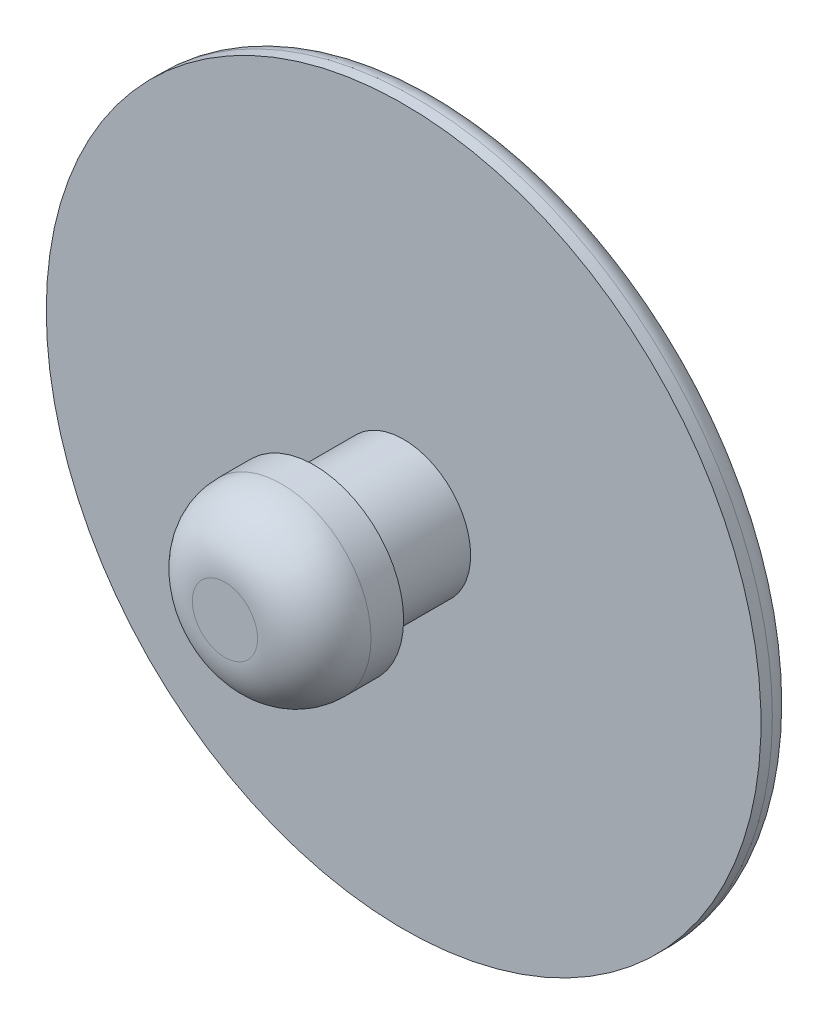
ISO-10303-21;
HEADER;
FILE_DESCRIPTION(('STEP AP214'),'2;1');
FILE_NAME('part.step','',(''),(''),'','','');
FILE_SCHEMA(('AUTOMOTIVE_DESIGN { 1 0 10303 214 1 1 1 1 }'));
ENDSEC;
DATA;
#1=APPLICATION_CONTEXT('core data for automotive mechanical design processes');
#2=APPLICATION_PROTOCOL_DEFINITION('international standard','automotive_design',2000,#1);
#3=PRODUCT_CONTEXT('',#1,'mechanical');
#4=PRODUCT('Part','Part','',(#3));
#5=PRODUCT_RELATED_PRODUCT_CATEGORY('part','',(#4));
#6=PRODUCT_DEFINITION_FORMATION('','',#4);
#7=PRODUCT_DEFINITION_CONTEXT('part definition',#1,'design');
#8=PRODUCT_DEFINITION('design','',#6,#7);
#9=PRODUCT_DEFINITION_SHAPE('','',#8);
#10=(LENGTH_UNIT() NAMED_UNIT(*) SI_UNIT(.MILLI.,.METRE.));
#11=(NAMED_UNIT(*) PLANE_ANGLE_UNIT() SI_UNIT($,.RADIAN.));
#12=(NAMED_UNIT(*) SI_UNIT($,.STERADIAN.) SOLID_ANGLE_UNIT());
#13=UNCERTAINTY_MEASURE_WITH_UNIT(LENGTH_MEASURE(1.E-05),#10,'distance_accuracy_value','');
#14=(GEOMETRIC_REPRESENTATION_CONTEXT(3) GLOBAL_UNCERTAINTY_ASSIGNED_CONTEXT((#13)) GLOBAL_UNIT_ASSIGNED_CONTEXT((#10,
#11,#12)) REPRESENTATION_CONTEXT('',''));
#15=CARTESIAN_POINT('',(0.,0.,0.));
#16=DIRECTION('',(0.,0.,1.));
#17=DIRECTION('',(1.,0.,0.));
#18=AXIS2_PLACEMENT_3D('',#15,#16,#17);
#19=CARTESIAN_POINT('',(0.,0.,0.762));
#20=DIRECTION('',(0.,0.,1.));
#21=DIRECTION('',(1.,0.,0.));
#22=AXIS2_PLACEMENT_3D('',#19,#20,#21);
#23=PLANE('',#22);
#24=CARTESIAN_POINT('',(0.,0.,0.762));
#25=DIRECTION('',(0.,0.,1.));
#26=DIRECTION('',(1.,0.,0.));
#27=AXIS2_PLACEMENT_3D('',#24,#25,#26);
#28=CIRCLE('',#27,8.);
#29=CARTESIAN_POINT('',(-8.,0.,0.762));
#30=VERTEX_POINT('',#29);
#31=EDGE_CURVE('E51',#30,#30,#28,.T.);
#32=ORIENTED_EDGE('',*,*,#31,.T.);
#33=EDGE_LOOP('',(#32));
#34=FACE_BOUND('',#33,.T.);
#35=CARTESIAN_POINT('',(0.,0.,0.762));
#36=DIRECTION('',(0.,0.,1.));
#37=DIRECTION('',(1.,0.,0.));
#38=AXIS2_PLACEMENT_3D('',#35,#36,#37);
#39=CIRCLE('',#38,1.5);
#40=CARTESIAN_POINT('',(1.5,0.,0.762));
#41=VERTEX_POINT('',#40);
#42=EDGE_CURVE('E55',#41,#41,#39,.T.);
#43=ORIENTED_EDGE('',*,*,#42,.F.);
#44=EDGE_LOOP('',(#43));
#45=FACE_BOUND('',#44,.T.);
#46=ADVANCED_FACE('F31',(#34,#45),#23,.T.);
#47=CARTESIAN_POINT('',(0.,0.,0.762));
#48=DIRECTION('',(0.,0.,-1.));
#49=DIRECTION('',(-1.,0.,0.));
#50=AXIS2_PLACEMENT_3D('',#47,#48,#49);
#51=CYLINDRICAL_SURFACE('',#50,8.);
#52=CARTESIAN_POINT('',(0.,0.,0.508));
#53=DIRECTION('',(0.,0.,1.));
#54=DIRECTION('',(1.,0.,0.));
#55=AXIS2_PLACEMENT_3D('',#52,#53,#54);
#56=CIRCLE('',#55,8.);
#57=CARTESIAN_POINT('',(-8.,0.,0.508));
#58=VERTEX_POINT('',#57);
#59=EDGE_CURVE('E46',#58,#58,#56,.T.);
#60=CARTESIAN_POINT('',(-8.,0.,0.508));
#61=CARTESIAN_POINT('',(-8.,0.,0.510645833333333));
#62=CARTESIAN_POINT('',(-8.,0.,0.513291666666667));
#63=CARTESIAN_POINT('',(-8.,0.,0.518583333333333));
#64=CARTESIAN_POINT('',(-8.,0.,0.521229166666667));
#65=CARTESIAN_POINT('',(-8.,0.,0.526520833333333));
#66=CARTESIAN_POINT('',(-8.,0.,0.529166666666667));
#67=CARTESIAN_POINT('',(-8.,0.,0.534458333333333));
#68=CARTESIAN_POINT('',(-8.,0.,0.537104166666666));
#69=CARTESIAN_POINT('',(-8.,0.,0.542395833333333));
#70=CARTESIAN_POINT('',(-8.,0.,0.545041666666667));
#71=CARTESIAN_POINT('',(-8.,0.,0.550333333333333));
#72=CARTESIAN_POINT('',(-8.,0.,0.552979166666667));
#73=CARTESIAN_POINT('',(-8.,0.,0.558270833333333));
#74=CARTESIAN_POINT('',(-8.,0.,0.560916666666667));
#75=CARTESIAN_POINT('',(-8.,0.,0.566208333333333));
#76=CARTESIAN_POINT('',(-8.,0.,0.568854166666667));
#77=CARTESIAN_POINT('',(-8.,0.,0.574145833333333));
#78=CARTESIAN_POINT('',(-8.,0.,0.576791666666666));
#79=CARTESIAN_POINT('',(-8.,0.,0.582083333333333));
#80=CARTESIAN_POINT('',(-8.,0.,0.584729166666667));
#81=CARTESIAN_POINT('',(-8.,0.,0.590020833333333));
#82=CARTESIAN_POINT('',(-8.,0.,0.592666666666667));
#83=CARTESIAN_POINT('',(-8.,0.,0.597958333333333));
#84=CARTESIAN_POINT('',(-8.,0.,0.600604166666667));
#85=CARTESIAN_POINT('',(-8.,0.,0.605895833333333));
#86=CARTESIAN_POINT('',(-8.,0.,0.608541666666667));
#87=CARTESIAN_POINT('',(-8.,0.,0.613833333333333));
#88=CARTESIAN_POINT('',(-8.,0.,0.616479166666667));
#89=CARTESIAN_POINT('',(-8.,0.,0.621770833333333));
#90=CARTESIAN_POINT('',(-8.,0.,0.624416666666667));
#91=CARTESIAN_POINT('',(-8.,0.,0.629708333333333));
#92=CARTESIAN_POINT('',(-8.,0.,0.632354166666667));
#93=CARTESIAN_POINT('',(-8.,0.,0.637645833333333));
#94=CARTESIAN_POINT('',(-8.,0.,0.640291666666667));
#95=CARTESIAN_POINT('',(-8.,0.,0.645583333333333));
#96=CARTESIAN_POINT('',(-8.,0.,0.648229166666667));
#97=CARTESIAN_POINT('',(-8.,0.,0.653520833333333));
#98=CARTESIAN_POINT('',(-8.,0.,0.656166666666667));
#99=CARTESIAN_POINT('',(-8.,0.,0.661458333333333));
#100=CARTESIAN_POINT('',(-8.,0.,0.664104166666667));
#101=CARTESIAN_POINT('',(-8.,0.,0.669395833333333));
#102=CARTESIAN_POINT('',(-8.,0.,0.672041666666667));
#103=CARTESIAN_POINT('',(-8.,0.,0.677333333333333));
#104=CARTESIAN_POINT('',(-8.,0.,0.679979166666667));
#105=CARTESIAN_POINT('',(-8.,0.,0.685270833333333));
#106=CARTESIAN_POINT('',(-8.,0.,0.687916666666667));
#107=CARTESIAN_POINT('',(-8.,0.,0.693208333333333));
#108=CARTESIAN_POINT('',(-8.,0.,0.695854166666667));
#109=CARTESIAN_POINT('',(-8.,0.,0.701145833333333));
#110=CARTESIAN_POINT('',(-8.,0.,0.703791666666667));
#111=CARTESIAN_POINT('',(-8.,0.,0.709083333333333));
#112=CARTESIAN_POINT('',(-8.,0.,0.711729166666667));
#113=CARTESIAN_POINT('',(-8.,0.,0.717020833333333));
#114=CARTESIAN_POINT('',(-8.,0.,0.719666666666667));
#115=CARTESIAN_POINT('',(-8.,0.,0.724958333333333));
#116=CARTESIAN_POINT('',(-8.,0.,0.727604166666666));
#117=CARTESIAN_POINT('',(-8.,0.,0.732895833333333));
#118=CARTESIAN_POINT('',(-8.,0.,0.735541666666667));
#119=CARTESIAN_POINT('',(-8.,0.,0.740833333333333));
#120=CARTESIAN_POINT('',(-8.,0.,0.743479166666667));
#121=CARTESIAN_POINT('',(-8.,0.,0.748770833333333));
#122=CARTESIAN_POINT('',(-8.,0.,0.751416666666667));
#123=CARTESIAN_POINT('',(-8.,0.,0.756708333333333));
#124=CARTESIAN_POINT('',(-8.,0.,0.759354166666667));
#125=CARTESIAN_POINT('',(-8.,0.,0.762));
#126=B_SPLINE_CURVE_WITH_KNOTS('',3,(#60,#61,#62,#63,#64,#65,#66,#67,#68,#69,#70,#71,#72,#73,
#74,#75,#76,#77,#78,#79,#80,#81,#82,#83,#84,#85,#86,#87,#88,#89,#90,#91,#92,#93,#94,#95,#96,#97,
#98,#99,#100,#101,#102,#103,#104,#105,#106,#107,#108,#109,#110,#111,#112,#113,#114,#115,#116,
#117,#118,#119,#120,#121,#122,#123,#124,#125),.UNSPECIFIED.,.F.,.F.,(4,2,2,2,2,2,2,2,2,2,2,2,2,
2,2,2,2,2,2,2,2,2,2,2,2,2,2,2,2,2,2,2,4),(0.,0.00793749999999992,0.0158749999999999,0.0238125,
0.0317499999999999,0.0396874999999999,0.0476249999999999,0.0555624999999999,0.0635,
0.0714374999999999,0.0793749999999999,0.0873124999999999,0.09525,0.1031875,0.111125,0.1190625,
0.127,0.1349375,0.142875,0.1508125,0.15875,0.1666875,0.174625,0.1825625,0.1905,0.1984375,
0.206375,0.2143125,0.22225,0.2301875,0.238125,0.2460625,0.254),.UNSPECIFIED.);
#127=EDGE_CURVE('BSEAM80',#58,#30,#126,.T.);
#128=ORIENTED_EDGE('',*,*,#59,.T.);
#129=ORIENTED_EDGE('',*,*,#31,.F.);
#130=ORIENTED_EDGE('',*,*,#127,.T.);
#131=ORIENTED_EDGE('',*,*,#127,.F.);
#132=EDGE_LOOP('',(#128,#130,#129,#131));
#133=FACE_BOUND('',#132,.T.);
#134=ADVANCED_FACE('F80',(#133),#51,.T.);
#135=CARTESIAN_POINT('',(0.,0.,0.));
#136=DIRECTION('',(0.,0.,1.));
#137=DIRECTION('',(1.,0.,0.));
#138=AXIS2_PLACEMENT_3D('',#135,#136,#137);
#139=PLANE('',#138);
#140=CARTESIAN_POINT('',(0.,0.,0.));
#141=DIRECTION('',(0.,0.,1.));
#142=DIRECTION('',(1.,0.,0.));
#143=AXIS2_PLACEMENT_3D('',#140,#141,#142);
#144=CIRCLE('',#143,7.492);
#145=CARTESIAN_POINT('',(7.492,0.,0.));
#146=VERTEX_POINT('',#145);
#147=EDGE_CURVE('E42',#146,#146,#144,.F.);
#148=ORIENTED_EDGE('',*,*,#147,.T.);
#149=EDGE_LOOP('',(#148));
#150=FACE_BOUND('',#149,.T.);
#151=ADVANCED_FACE('F86',(#150),#139,.F.);
#152=CARTESIAN_POINT('',(0.,0.,0.508));
#153=DIRECTION('',(0.,0.,1.));
#154=DIRECTION('',(1.,0.,0.));
#155=AXIS2_PLACEMENT_3D('',#152,#153,#154);
#156=TOROIDAL_SURFACE('',#155,7.492,0.508);
#157=ORIENTED_EDGE('',*,*,#147,.F.);
#158=EDGE_LOOP('',(#157));
#159=FACE_BOUND('',#158,.T.);
#160=ORIENTED_EDGE('',*,*,#59,.F.);
#161=EDGE_LOOP('',(#160));
#162=FACE_BOUND('',#161,.T.);
#163=ADVANCED_FACE('F75',(#159,#162),#156,.T.);
#164=CARTESIAN_POINT('',(0.,0.,2.762));
#165=DIRECTION('',(0.,0.,-1.));
#166=DIRECTION('',(-1.,0.,0.));
#167=AXIS2_PLACEMENT_3D('',#164,#165,#166);
#168=CYLINDRICAL_SURFACE('',#167,1.5);
#169=CARTESIAN_POINT('',(0.,0.,2.762));
#170=DIRECTION('',(0.,0.,1.));
#171=DIRECTION('',(1.,0.,0.));
#172=AXIS2_PLACEMENT_3D('',#169,#170,#171);
#173=CIRCLE('',#172,1.5);
#174=CARTESIAN_POINT('',(1.5,0.,2.762));
#175=VERTEX_POINT('',#174);
#176=EDGE_CURVE('E54',#175,#175,#173,.T.);
#177=ORIENTED_EDGE('',*,*,#176,.F.);
#178=EDGE_LOOP('',(#177));
#179=FACE_BOUND('',#178,.T.);
#180=ORIENTED_EDGE('',*,*,#42,.T.);
#181=EDGE_LOOP('',(#180));
#182=FACE_BOUND('',#181,.T.);
#183=ADVANCED_FACE('F69',(#179,#182),#168,.T.);
#184=CARTESIAN_POINT('',(0.,0.,2.762));
#185=DIRECTION('',(0.,0.,1.));
#186=DIRECTION('',(1.,0.,0.));
#187=AXIS2_PLACEMENT_3D('',#184,#185,#186);
#188=PLANE('',#187);
#189=CARTESIAN_POINT('',(0.,0.,2.762));
#190=DIRECTION('',(0.,0.,1.));
#191=DIRECTION('',(1.,0.,0.));
#192=AXIS2_PLACEMENT_3D('',#189,#190,#191);
#193=CIRCLE('',#192,2.);
#194=CARTESIAN_POINT('',(2.,0.,2.762));
#195=VERTEX_POINT('',#194);
#196=EDGE_CURVE('E58',#195,#195,#193,.T.);
#197=ORIENTED_EDGE('',*,*,#196,.F.);
#198=EDGE_LOOP('',(#197));
#199=FACE_BOUND('',#198,.T.);
#200=ORIENTED_EDGE('',*,*,#176,.T.);
#201=EDGE_LOOP('',(#200));
#202=FACE_BOUND('',#201,.T.);
#203=ADVANCED_FACE('F66',(#199,#202),#188,.F.);
#204=CARTESIAN_POINT('',(0.,0.,4.762));
#205=DIRECTION('',(0.,0.,-1.));
#206=DIRECTION('',(-1.,0.,0.));
#207=AXIS2_PLACEMENT_3D('',#204,#205,#206);
#208=CYLINDRICAL_SURFACE('',#207,2.);
#209=CARTESIAN_POINT('',(0.,0.,3.492));
#210=DIRECTION('',(0.,0.,1.));
#211=DIRECTION('',(1.,0.,0.));
#212=AXIS2_PLACEMENT_3D('',#209,#210,#211);
#213=CIRCLE('',#212,2.);
#214=CARTESIAN_POINT('',(2.,0.,3.492));
#215=VERTEX_POINT('',#214);
#216=EDGE_CURVE('E10',#215,#215,#213,.F.);
#217=ORIENTED_EDGE('',*,*,#216,.T.);
#218=EDGE_LOOP('',(#217));
#219=FACE_BOUND('',#218,.T.);
#220=ORIENTED_EDGE('',*,*,#196,.T.);
#221=EDGE_LOOP('',(#220));
#222=FACE_BOUND('',#221,.T.);
#223=ADVANCED_FACE('F64',(#219,#222),#208,.T.);
#224=CARTESIAN_POINT('',(0.,0.,4.762));
#225=DIRECTION('',(0.,0.,1.));
#226=DIRECTION('',(1.,0.,0.));
#227=AXIS2_PLACEMENT_3D('',#224,#225,#226);
#228=PLANE('',#227);
#229=CARTESIAN_POINT('',(0.,0.,4.762));
#230=DIRECTION('',(0.,0.,1.));
#231=DIRECTION('',(1.,0.,0.));
#232=AXIS2_PLACEMENT_3D('',#229,#230,#231);
#233=CIRCLE('',#232,0.73);
#234=CARTESIAN_POINT('',(0.73,0.,4.762));
#235=VERTEX_POINT('',#234);
#236=EDGE_CURVE('E38',#235,#235,#233,.T.);
#237=ORIENTED_EDGE('',*,*,#236,.T.);
#238=EDGE_LOOP('',(#237));
#239=FACE_BOUND('',#238,.T.);
#240=ADVANCED_FACE('F118',(#239),#228,.T.);
#241=CARTESIAN_POINT('',(0.,0.,3.492));
#242=DIRECTION('',(0.,0.,1.));
#243=DIRECTION('',(1.,0.,0.));
#244=AXIS2_PLACEMENT_3D('',#241,#242,#243);
#245=DEGENERATE_TOROIDAL_SURFACE('',#244,0.73,1.27,.T.);
#246=ORIENTED_EDGE('',*,*,#216,.F.);
#247=EDGE_LOOP('',(#246));
#248=FACE_BOUND('',#247,.T.);
#249=ORIENTED_EDGE('',*,*,#236,.F.);
#250=EDGE_LOOP('',(#249));
#251=FACE_BOUND('',#250,.T.);
#252=ADVANCED_FACE('F33',(#248,#251),#245,.T.);
#253=CLOSED_SHELL('',(#46,#134,#151,#163,#183,#203,#223,#240,#252));
#254=MANIFOLD_SOLID_BREP('B2',#253);
#255=ADVANCED_BREP_SHAPE_REPRESENTATION('',(#18,#254),#14);
#256=SHAPE_DEFINITION_REPRESENTATION(#9,#255);
ENDSEC;
END-ISO-10303-21;
